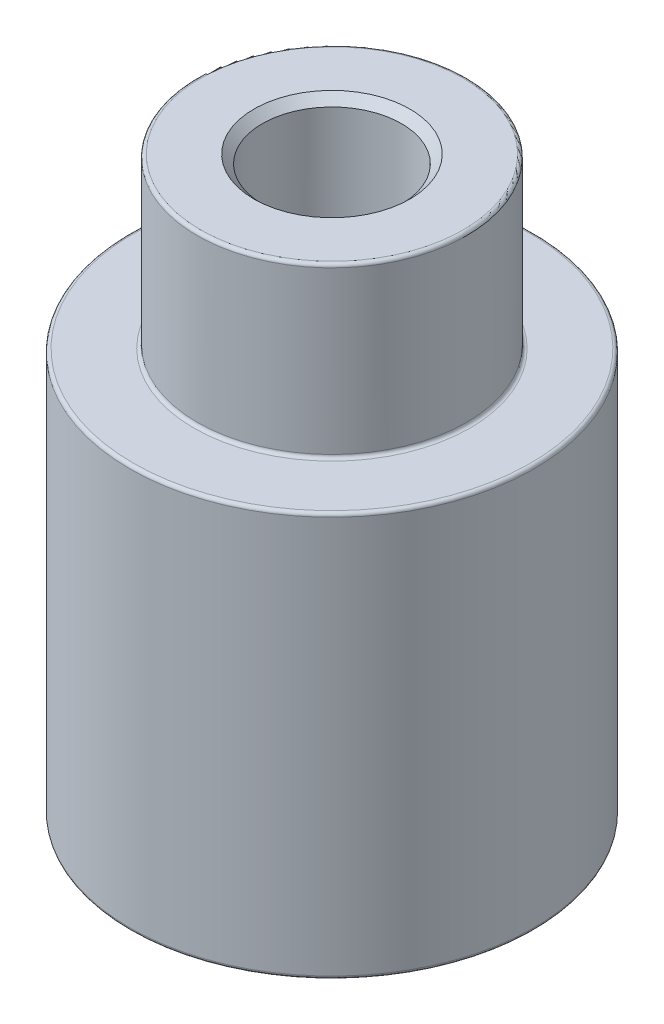
ISO-10303-21;
HEADER;
FILE_DESCRIPTION(('STEP AP214'),'2;1');
FILE_NAME('part.step','',(''),(''),'','','');
FILE_SCHEMA(('AUTOMOTIVE_DESIGN { 1 0 10303 214 1 1 1 1 }'));
ENDSEC;
DATA;
#1=APPLICATION_CONTEXT('core data for automotive mechanical design processes');
#2=APPLICATION_PROTOCOL_DEFINITION('international standard','automotive_design',2000,#1);
#3=PRODUCT_CONTEXT('',#1,'mechanical');
#4=PRODUCT('Part','Part','',(#3));
#5=PRODUCT_RELATED_PRODUCT_CATEGORY('part','',(#4));
#6=PRODUCT_DEFINITION_FORMATION('','',#4);
#7=PRODUCT_DEFINITION_CONTEXT('part definition',#1,'design');
#8=PRODUCT_DEFINITION('design','',#6,#7);
#9=PRODUCT_DEFINITION_SHAPE('','',#8);
#10=(LENGTH_UNIT() NAMED_UNIT(*) SI_UNIT(.MILLI.,.METRE.));
#11=(NAMED_UNIT(*) PLANE_ANGLE_UNIT() SI_UNIT($,.RADIAN.));
#12=(NAMED_UNIT(*) SI_UNIT($,.STERADIAN.) SOLID_ANGLE_UNIT());
#13=UNCERTAINTY_MEASURE_WITH_UNIT(LENGTH_MEASURE(1.E-05),#10,'distance_accuracy_value','');
#14=(GEOMETRIC_REPRESENTATION_CONTEXT(3) GLOBAL_UNCERTAINTY_ASSIGNED_CONTEXT((#13)) GLOBAL_UNIT_ASSIGNED_CONTEXT((#10,
#11,#12)) REPRESENTATION_CONTEXT('',''));
#15=CARTESIAN_POINT('',(0.,0.,0.));
#16=DIRECTION('',(0.,0.,1.));
#17=DIRECTION('',(1.,0.,0.));
#18=AXIS2_PLACEMENT_3D('',#15,#16,#17);
#19=CARTESIAN_POINT('',(0.,4.99999999999545,0.));
#20=DIRECTION('',(0.,1.,0.));
#21=DIRECTION('',(0.,0.,1.));
#22=AXIS2_PLACEMENT_3D('',#19,#20,#21);
#23=CONICAL_SURFACE('',#22,2.31700000006185,0.785398163397448);
#24=CARTESIAN_POINT('',(0.,4.75,0.));
#25=DIRECTION('',(0.,1.,0.));
#26=DIRECTION('',(0.,0.,1.));
#27=AXIS2_PLACEMENT_3D('',#24,#25,#26);
#28=CIRCLE('',#27,2.067);
#29=CARTESIAN_POINT('',(0.,4.75,2.067));
#30=VERTEX_POINT('',#29);
#31=EDGE_CURVE('E143',#30,#30,#28,.F.);
#32=ORIENTED_EDGE('',*,*,#31,.T.);
#33=EDGE_LOOP('',(#32));
#34=FACE_BOUND('',#33,.T.);
#35=CARTESIAN_POINT('',(0.,4.99999999999545,0.));
#36=DIRECTION('',(0.,1.,0.));
#37=DIRECTION('',(0.,0.,1.));
#38=AXIS2_PLACEMENT_3D('',#35,#36,#37);
#39=CIRCLE('',#38,2.31700000006185);
#40=CARTESIAN_POINT('',(0.,4.99999999999545,2.31700000006185));
#41=VERTEX_POINT('',#40);
#42=EDGE_CURVE('E28',#41,#41,#39,.T.);
#43=ORIENTED_EDGE('',*,*,#42,.T.);
#44=EDGE_LOOP('',(#43));
#45=FACE_BOUND('',#44,.T.);
#46=ADVANCED_FACE('F25',(#34,#45),#23,.F.);
#47=CARTESIAN_POINT('',(0.,5.,0.));
#48=DIRECTION('',(0.,-1.,0.));
#49=DIRECTION('',(0.,0.,-1.));
#50=AXIS2_PLACEMENT_3D('',#47,#48,#49);
#51=PLANE('',#50);
#52=CARTESIAN_POINT('',(0.,5.,0.));
#53=DIRECTION('',(0.,-1.,0.));
#54=DIRECTION('',(0.,0.,-1.));
#55=AXIS2_PLACEMENT_3D('',#52,#53,#54);
#56=CIRCLE('',#55,3.9);
#57=CARTESIAN_POINT('',(0.,5.,-3.9));
#58=VERTEX_POINT('',#57);
#59=EDGE_CURVE('E138',#58,#58,#56,.T.);
#60=ORIENTED_EDGE('',*,*,#59,.F.);
#61=EDGE_LOOP('',(#60));
#62=FACE_BOUND('',#61,.T.);
#63=ORIENTED_EDGE('',*,*,#42,.F.);
#64=EDGE_LOOP('',(#63));
#65=FACE_BOUND('',#64,.T.);
#66=ADVANCED_FACE('F187',(#62,#65),#51,.F.);
#67=CARTESIAN_POINT('',(0.,-19.0208242989286,0.));
#68=DIRECTION('',(0.,1.,0.));
#69=DIRECTION('',(0.,0.,1.));
#70=AXIS2_PLACEMENT_3D('',#67,#68,#69);
#71=CYLINDRICAL_SURFACE('',#70,2.067);
#72=ORIENTED_EDGE('',*,*,#31,.F.);
#73=EDGE_LOOP('',(#72));
#74=FACE_BOUND('',#73,.T.);
#75=CARTESIAN_POINT('',(0.,-1.75000000001546,0.));
#76=DIRECTION('',(0.,-1.,0.));
#77=DIRECTION('',(0.,0.,1.));
#78=AXIS2_PLACEMENT_3D('',#75,#76,#77);
#79=CIRCLE('',#78,2.06700000001092);
#80=CARTESIAN_POINT('',(0.,-1.75000000001546,2.06700000001092));
#81=VERTEX_POINT('',#80);
#82=EDGE_CURVE('E133',#81,#81,#79,.T.);
#83=ORIENTED_EDGE('',*,*,#82,.T.);
#84=EDGE_LOOP('',(#83));
#85=FACE_BOUND('',#84,.T.);
#86=ADVANCED_FACE('F152',(#74,#85),#71,.F.);
#87=CARTESIAN_POINT('',(0.,4.9,0.));
#88=DIRECTION('',(0.,-1.,0.));
#89=DIRECTION('',(0.,0.,-1.));
#90=AXIS2_PLACEMENT_3D('',#87,#88,#89);
#91=TOROIDAL_SURFACE('',#90,3.9,0.1);
#92=CARTESIAN_POINT('',(0.,4.9,0.));
#93=DIRECTION('',(0.,-1.,0.));
#94=DIRECTION('',(0.,0.,-1.));
#95=AXIS2_PLACEMENT_3D('',#92,#93,#94);
#96=CIRCLE('',#95,4.);
#97=CARTESIAN_POINT('',(0.,4.9,-4.));
#98=VERTEX_POINT('',#97);
#99=EDGE_CURVE('E124',#98,#98,#96,.T.);
#100=ORIENTED_EDGE('',*,*,#99,.F.);
#101=EDGE_LOOP('',(#100));
#102=FACE_BOUND('',#101,.T.);
#103=ORIENTED_EDGE('',*,*,#59,.T.);
#104=EDGE_LOOP('',(#103));
#105=FACE_BOUND('',#104,.T.);
#106=ADVANCED_FACE('F146',(#102,#105),#91,.T.);
#107=CARTESIAN_POINT('',(0.,-1.99999999995271,0.));
#108=DIRECTION('',(0.,-1.,0.));
#109=DIRECTION('',(0.,0.,-1.));
#110=AXIS2_PLACEMENT_3D('',#107,#108,#109);
#111=CONICAL_SURFACE('',#110,2.31699999994817,0.785398163397448);
#112=ORIENTED_EDGE('',*,*,#82,.F.);
#113=EDGE_LOOP('',(#112));
#114=FACE_BOUND('',#113,.T.);
#115=CARTESIAN_POINT('',(0.,-1.99999999995271,0.));
#116=DIRECTION('',(0.,-1.,0.));
#117=DIRECTION('',(0.,0.,-1.));
#118=AXIS2_PLACEMENT_3D('',#115,#116,#117);
#119=CIRCLE('',#118,2.31699999994817);
#120=CARTESIAN_POINT('',(0.,-1.99999999995271,-2.31699999994817));
#121=VERTEX_POINT('',#120);
#122=EDGE_CURVE('E132',#121,#121,#119,.T.);
#123=ORIENTED_EDGE('',*,*,#122,.T.);
#124=EDGE_LOOP('',(#123));
#125=FACE_BOUND('',#124,.T.);
#126=ADVANCED_FACE('F151',(#114,#125),#111,.F.);
#127=CARTESIAN_POINT('',(0.,5.,0.));
#128=DIRECTION('',(0.,-1.,0.));
#129=DIRECTION('',(0.,0.,-1.));
#130=AXIS2_PLACEMENT_3D('',#127,#128,#129);
#131=CYLINDRICAL_SURFACE('',#130,4.);
#132=CARTESIAN_POINT('',(0.,0.1,0.));
#133=DIRECTION('',(0.,1.,0.));
#134=DIRECTION('',(0.,0.,1.));
#135=AXIS2_PLACEMENT_3D('',#132,#133,#134);
#136=CIRCLE('',#135,4.);
#137=CARTESIAN_POINT('',(0.,0.1,4.));
#138=VERTEX_POINT('',#137);
#139=EDGE_CURVE('E88',#138,#138,#136,.T.);
#140=ORIENTED_EDGE('',*,*,#139,.T.);
#141=EDGE_LOOP('',(#140));
#142=FACE_BOUND('',#141,.T.);
#143=ORIENTED_EDGE('',*,*,#99,.T.);
#144=EDGE_LOOP('',(#143));
#145=FACE_BOUND('',#144,.T.);
#146=ADVANCED_FACE('F171',(#142,#145),#131,.T.);
#147=CARTESIAN_POINT('',(0.,-2.,0.));
#148=DIRECTION('',(0.,1.,0.));
#149=DIRECTION('',(0.,0.,1.));
#150=AXIS2_PLACEMENT_3D('',#147,#148,#149);
#151=PLANE('',#150);
#152=DIRECTION('',(-0.499999908452591,0.,0.866025456639353));
#153=VECTOR('',#152,1.);
#154=CARTESIAN_POINT('',(-4.67653718043597,-2.,0.));
#155=LINE('',#154,#153);
#156=CARTESIAN_POINT('',(-4.67653718043597,-2.,0.));
#157=VERTEX_POINT('',#156);
#158=CARTESIAN_POINT('',(-2.33826901834283,-2.,-4.05000024717801));
#159=VERTEX_POINT('',#158);
#160=EDGE_CURVE('E84',#157,#159,#155,.F.);
#161=ORIENTED_EDGE('',*,*,#160,.T.);
#162=DIRECTION('',(-0.999999999999994,0.,-1.05709839671575E-07));
#163=VECTOR('',#162,1.);
#164=CARTESIAN_POINT('',(-2.33826887563457,-2.,-4.05000049435603));
#165=LINE('',#164,#163);
#166=CARTESIAN_POINT('',(2.33826859021799,-2.,-4.05));
#167=VERTEX_POINT('',#166);
#168=EDGE_CURVE('E79',#159,#167,#165,.F.);
#169=ORIENTED_EDGE('',*,*,#168,.T.);
#170=DIRECTION('',(-0.500000091547404,0.,-0.866025350929514));
#171=VECTOR('',#170,1.);
#172=CARTESIAN_POINT('',(2.33826859021799,-2.,-4.05));
#173=LINE('',#172,#171);
#174=CARTESIAN_POINT('',(4.67653775126914,-2.,0.));
#175=VERTEX_POINT('',#174);
#176=EDGE_CURVE('E76',#167,#175,#173,.F.);
#177=ORIENTED_EDGE('',*,*,#176,.T.);
#178=DIRECTION('',(0.500000091547404,0.,-0.866025350929514));
#179=VECTOR('',#178,1.);
#180=CARTESIAN_POINT('',(4.67653775126914,-2.,0.));
#181=LINE('',#180,#179);
#182=CARTESIAN_POINT('',(2.33826851886383,-2.,4.050000123589));
#183=VERTEX_POINT('',#182);
#184=EDGE_CURVE('E102',#175,#183,#181,.F.);
#185=ORIENTED_EDGE('',*,*,#184,.T.);
#186=DIRECTION('',(0.999999999999994,0.,-1.05709839300633E-07));
#187=VECTOR('',#186,1.);
#188=CARTESIAN_POINT('',(2.33826859021799,-2.,4.05));
#189=LINE('',#188,#187);
#190=CARTESIAN_POINT('',(-2.33826887563456,-2.,4.05000049435602));
#191=VERTEX_POINT('',#190);
#192=EDGE_CURVE('E287',#183,#191,#189,.F.);
#193=ORIENTED_EDGE('',*,*,#192,.T.);
#194=DIRECTION('',(0.499999908452591,0.,0.866025456639353));
#195=VECTOR('',#194,1.);
#196=CARTESIAN_POINT('',(-2.33826887563457,-2.,4.05000049435602));
#197=LINE('',#196,#195);
#198=EDGE_CURVE('E282',#191,#157,#197,.F.);
#199=ORIENTED_EDGE('',*,*,#198,.T.);
#200=EDGE_LOOP('',(#161,#169,#177,#185,#193,#199));
#201=FACE_BOUND('',#200,.T.);
#202=ORIENTED_EDGE('',*,*,#122,.F.);
#203=EDGE_LOOP('',(#202));
#204=FACE_BOUND('',#203,.T.);
#205=ADVANCED_FACE('F81',(#201,#204),#151,.F.);
#206=CARTESIAN_POINT('',(0.,0.1,0.));
#207=DIRECTION('',(0.,1.,0.));
#208=DIRECTION('',(0.,0.,1.));
#209=AXIS2_PLACEMENT_3D('',#206,#207,#208);
#210=TOROIDAL_SURFACE('',#209,4.1,0.1);
#211=CARTESIAN_POINT('',(0.,0.,0.));
#212=DIRECTION('',(0.,1.,0.));
#213=DIRECTION('',(0.,0.,1.));
#214=AXIS2_PLACEMENT_3D('',#211,#212,#213);
#215=CIRCLE('',#214,4.1);
#216=CARTESIAN_POINT('',(0.,0.,4.1));
#217=VERTEX_POINT('',#216);
#218=EDGE_CURVE('E278',#217,#217,#215,.F.);
#219=ORIENTED_EDGE('',*,*,#218,.F.);
#220=EDGE_LOOP('',(#219));
#221=FACE_BOUND('',#220,.T.);
#222=ORIENTED_EDGE('',*,*,#139,.F.);
#223=EDGE_LOOP('',(#222));
#224=FACE_BOUND('',#223,.T.);
#225=ADVANCED_FACE('F110',(#221,#224),#210,.F.);
#226=CARTESIAN_POINT('',(-2.33826887563457,-2.,-4.05000049435603));
#227=DIRECTION('',(1.05709839671575E-07,0.,-0.999999999999994));
#228=DIRECTION('',(-0.999999999999994,0.,-1.05709839671575E-07));
#229=AXIS2_PLACEMENT_3D('',#226,#227,#228);
#230=PLANE('',#229);
#231=DIRECTION('',(0.,1.,0.));
#232=VECTOR('',#231,1.);
#233=CARTESIAN_POINT('',(2.33826859021799,-2.,-4.05));
#234=LINE('',#233,#232);
#235=CARTESIAN_POINT('',(2.33826851886383,-12.,-4.05000012358901));
#236=VERTEX_POINT('',#235);
#237=EDGE_CURVE('E87',#236,#167,#234,.T.);
#238=ORIENTED_EDGE('',*,*,#237,.T.);
#239=ORIENTED_EDGE('',*,*,#168,.F.);
#240=DIRECTION('',(0.,1.,0.));
#241=VECTOR('',#240,1.);
#242=CARTESIAN_POINT('',(-2.33826887563457,-2.,-4.05000049435603));
#243=LINE('',#242,#241);
#244=CARTESIAN_POINT('',(-2.33826887563457,-12.,-4.05000049435603));
#245=VERTEX_POINT('',#244);
#246=EDGE_CURVE('E271',#159,#245,#243,.F.);
#247=ORIENTED_EDGE('',*,*,#246,.T.);
#248=DIRECTION('',(1.,0.,0.));
#249=VECTOR('',#248,1.);
#250=CARTESIAN_POINT('',(0.,-12.,-4.05000049435603));
#251=LINE('',#250,#249);
#252=EDGE_CURVE('E93',#245,#236,#251,.T.);
#253=ORIENTED_EDGE('',*,*,#252,.T.);
#254=EDGE_LOOP('',(#238,#239,#247,#253));
#255=FACE_BOUND('',#254,.T.);
#256=ADVANCED_FACE('F91',(#255),#230,.F.);
#257=CARTESIAN_POINT('',(2.33826859021799,-2.,-4.05));
#258=DIRECTION('',(0.866025350929514,0.,-0.500000091547404));
#259=DIRECTION('',(-0.500000091547404,0.,-0.866025350929514));
#260=AXIS2_PLACEMENT_3D('',#257,#258,#259);
#261=PLANE('',#260);
#262=DIRECTION('',(0.,1.,0.));
#263=VECTOR('',#262,1.);
#264=CARTESIAN_POINT('',(4.67653775126914,-2.,0.));
#265=LINE('',#264,#263);
#266=CARTESIAN_POINT('',(4.67653775126914,-12.,0.));
#267=VERTEX_POINT('',#266);
#268=EDGE_CURVE('E99',#267,#175,#265,.T.);
#269=ORIENTED_EDGE('',*,*,#268,.T.);
#270=ORIENTED_EDGE('',*,*,#176,.F.);
#271=ORIENTED_EDGE('',*,*,#237,.F.);
#272=DIRECTION('',(0.500000091547403,0.,0.866025350929514));
#273=VECTOR('',#272,1.);
#274=CARTESIAN_POINT('',(2.33826859021799,-12.,-4.05));
#275=LINE('',#274,#273);
#276=EDGE_CURVE('E307',#236,#267,#275,.T.);
#277=ORIENTED_EDGE('',*,*,#276,.T.);
#278=EDGE_LOOP('',(#269,#270,#271,#277));
#279=FACE_BOUND('',#278,.T.);
#280=ADVANCED_FACE('F97',(#279),#261,.F.);
#281=CARTESIAN_POINT('',(4.67653775126914,-2.,0.));
#282=DIRECTION('',(0.866025350929514,0.,0.500000091547404));
#283=DIRECTION('',(0.500000091547404,0.,-0.866025350929514));
#284=AXIS2_PLACEMENT_3D('',#281,#282,#283);
#285=PLANE('',#284);
#286=DIRECTION('',(0.,1.,0.));
#287=VECTOR('',#286,1.);
#288=CARTESIAN_POINT('',(2.33826859021799,-2.,4.05));
#289=LINE('',#288,#287);
#290=CARTESIAN_POINT('',(2.33826859021799,-12.,4.05));
#291=VERTEX_POINT('',#290);
#292=EDGE_CURVE('E289',#291,#183,#289,.T.);
#293=ORIENTED_EDGE('',*,*,#292,.T.);
#294=ORIENTED_EDGE('',*,*,#184,.F.);
#295=ORIENTED_EDGE('',*,*,#268,.F.);
#296=DIRECTION('',(-0.500000091547403,0.,0.866025350929514));
#297=VECTOR('',#296,1.);
#298=CARTESIAN_POINT('',(4.67653775126914,-12.,0.));
#299=LINE('',#298,#297);
#300=EDGE_CURVE('E296',#267,#291,#299,.T.);
#301=ORIENTED_EDGE('',*,*,#300,.T.);
#302=EDGE_LOOP('',(#293,#294,#295,#301));
#303=FACE_BOUND('',#302,.T.);
#304=ADVANCED_FACE('F294',(#303),#285,.F.);
#305=CARTESIAN_POINT('',(2.33826859021799,-2.,4.05));
#306=DIRECTION('',(1.05709839300633E-07,0.,0.999999999999994));
#307=DIRECTION('',(0.999999999999994,0.,-1.05709839300633E-07));
#308=AXIS2_PLACEMENT_3D('',#305,#306,#307);
#309=PLANE('',#308);
#310=DIRECTION('',(0.,1.,0.));
#311=VECTOR('',#310,1.);
#312=CARTESIAN_POINT('',(-2.33826887563457,-2.,4.05000049435602));
#313=LINE('',#312,#311);
#314=CARTESIAN_POINT('',(-2.33826894698869,-12.,4.05000037076702));
#315=VERTEX_POINT('',#314);
#316=EDGE_CURVE('E284',#315,#191,#313,.T.);
#317=ORIENTED_EDGE('',*,*,#316,.T.);
#318=ORIENTED_EDGE('',*,*,#192,.F.);
#319=ORIENTED_EDGE('',*,*,#292,.F.);
#320=DIRECTION('',(1.,0.,0.));
#321=VECTOR('',#320,1.);
#322=CARTESIAN_POINT('',(0.,-12.,4.05));
#323=LINE('',#322,#321);
#324=EDGE_CURVE('E301',#291,#315,#323,.F.);
#325=ORIENTED_EDGE('',*,*,#324,.T.);
#326=EDGE_LOOP('',(#317,#318,#319,#325));
#327=FACE_BOUND('',#326,.T.);
#328=ADVANCED_FACE('F299',(#327),#309,.F.);
#329=CARTESIAN_POINT('',(-2.33826887563457,-2.,4.05000049435602));
#330=DIRECTION('',(-0.866025456639353,0.,0.499999908452591));
#331=DIRECTION('',(0.499999908452591,0.,0.866025456639353));
#332=AXIS2_PLACEMENT_3D('',#329,#330,#331);
#333=PLANE('',#332);
#334=DIRECTION('',(0.,1.,0.));
#335=VECTOR('',#334,1.);
#336=CARTESIAN_POINT('',(-4.67653718043597,-2.,0.));
#337=LINE('',#336,#335);
#338=CARTESIAN_POINT('',(-4.67653718043597,-12.,0.));
#339=VERTEX_POINT('',#338);
#340=EDGE_CURVE('E280',#339,#157,#337,.T.);
#341=ORIENTED_EDGE('',*,*,#340,.T.);
#342=ORIENTED_EDGE('',*,*,#198,.F.);
#343=ORIENTED_EDGE('',*,*,#316,.F.);
#344=DIRECTION('',(-0.499999908452593,0.,-0.866025456639352));
#345=VECTOR('',#344,1.);
#346=CARTESIAN_POINT('',(-2.33826887563456,-12.,4.05000049435602));
#347=LINE('',#346,#345);
#348=EDGE_CURVE('E43',#315,#339,#347,.T.);
#349=ORIENTED_EDGE('',*,*,#348,.T.);
#350=EDGE_LOOP('',(#341,#342,#343,#349));
#351=FACE_BOUND('',#350,.T.);
#352=ADVANCED_FACE('F302',(#351),#333,.F.);
#353=CARTESIAN_POINT('',(-4.67653718043597,-2.,0.));
#354=DIRECTION('',(-0.866025456639353,0.,-0.499999908452591));
#355=DIRECTION('',(-0.499999908452591,0.,0.866025456639353));
#356=AXIS2_PLACEMENT_3D('',#353,#354,#355);
#357=PLANE('',#356);
#358=ORIENTED_EDGE('',*,*,#246,.F.);
#359=ORIENTED_EDGE('',*,*,#160,.F.);
#360=ORIENTED_EDGE('',*,*,#340,.F.);
#361=DIRECTION('',(0.49999990845259,0.,-0.866025456639354));
#362=VECTOR('',#361,1.);
#363=CARTESIAN_POINT('',(-4.67653718043597,-12.,0.));
#364=LINE('',#363,#362);
#365=EDGE_CURVE('E229',#339,#245,#364,.T.);
#366=ORIENTED_EDGE('',*,*,#365,.T.);
#367=EDGE_LOOP('',(#358,#359,#360,#366));
#368=FACE_BOUND('',#367,.T.);
#369=ADVANCED_FACE('F244',(#368),#357,.F.);
#370=CARTESIAN_POINT('',(0.,0.,0.));
#371=DIRECTION('',(0.,1.,0.));
#372=DIRECTION('',(0.,0.,1.));
#373=AXIS2_PLACEMENT_3D('',#370,#371,#372);
#374=PLANE('',#373);
#375=ORIENTED_EDGE('',*,*,#218,.T.);
#376=EDGE_LOOP('',(#375));
#377=FACE_BOUND('',#376,.T.);
#378=CARTESIAN_POINT('',(0.,0.,0.));
#379=DIRECTION('',(0.,-1.,0.));
#380=DIRECTION('',(0.,0.,1.));
#381=AXIS2_PLACEMENT_3D('',#378,#379,#380);
#382=CIRCLE('',#381,5.9);
#383=CARTESIAN_POINT('',(0.,0.,5.9));
#384=VERTEX_POINT('',#383);
#385=EDGE_CURVE('E267',#384,#384,#382,.T.);
#386=ORIENTED_EDGE('',*,*,#385,.F.);
#387=EDGE_LOOP('',(#386));
#388=FACE_BOUND('',#387,.T.);
#389=ADVANCED_FACE('F240',(#377,#388),#374,.T.);
#390=CARTESIAN_POINT('',(0.,-12.,0.));
#391=DIRECTION('',(0.,1.,0.));
#392=DIRECTION('',(0.,0.,1.));
#393=AXIS2_PLACEMENT_3D('',#390,#391,#392);
#394=PLANE('',#393);
#395=CARTESIAN_POINT('',(0.,-12.,0.));
#396=DIRECTION('',(0.,1.,0.));
#397=DIRECTION('',(0.,0.,1.));
#398=AXIS2_PLACEMENT_3D('',#395,#396,#397);
#399=CIRCLE('',#398,5.9);
#400=CARTESIAN_POINT('',(0.,-12.,5.9));
#401=VERTEX_POINT('',#400);
#402=EDGE_CURVE('E225',#401,#401,#399,.T.);
#403=ORIENTED_EDGE('',*,*,#402,.F.);
#404=EDGE_LOOP('',(#403));
#405=FACE_BOUND('',#404,.T.);
#406=ORIENTED_EDGE('',*,*,#348,.F.);
#407=ORIENTED_EDGE('',*,*,#324,.F.);
#408=ORIENTED_EDGE('',*,*,#300,.F.);
#409=ORIENTED_EDGE('',*,*,#276,.F.);
#410=ORIENTED_EDGE('',*,*,#252,.F.);
#411=ORIENTED_EDGE('',*,*,#365,.F.);
#412=EDGE_LOOP('',(#406,#407,#408,#409,#410,#411));
#413=FACE_BOUND('',#412,.T.);
#414=ADVANCED_FACE('F231',(#405,#413),#394,.F.);
#415=CARTESIAN_POINT('',(0.,-0.0999999999999994,0.));
#416=DIRECTION('',(0.,1.,0.));
#417=DIRECTION('',(0.,0.,1.));
#418=AXIS2_PLACEMENT_3D('',#415,#416,#417);
#419=TOROIDAL_SURFACE('',#418,5.9,0.1);
#420=ORIENTED_EDGE('',*,*,#385,.T.);
#421=EDGE_LOOP('',(#420));
#422=FACE_BOUND('',#421,.T.);
#423=CARTESIAN_POINT('',(0.,-0.0999999999999994,0.));
#424=DIRECTION('',(0.,1.,0.));
#425=DIRECTION('',(0.,0.,1.));
#426=AXIS2_PLACEMENT_3D('',#423,#424,#425);
#427=CIRCLE('',#426,6.);
#428=CARTESIAN_POINT('',(0.,-0.0999999999999994,6.));
#429=VERTEX_POINT('',#428);
#430=EDGE_CURVE('E34',#429,#429,#427,.F.);
#431=ORIENTED_EDGE('',*,*,#430,.F.);
#432=EDGE_LOOP('',(#431));
#433=FACE_BOUND('',#432,.T.);
#434=ADVANCED_FACE('F204',(#422,#433),#419,.T.);
#435=CARTESIAN_POINT('',(0.,-11.9,0.));
#436=DIRECTION('',(0.,1.,0.));
#437=DIRECTION('',(0.,0.,1.));
#438=AXIS2_PLACEMENT_3D('',#435,#436,#437);
#439=TOROIDAL_SURFACE('',#438,5.9,0.1);
#440=CARTESIAN_POINT('',(0.,-11.9,0.));
#441=DIRECTION('',(0.,1.,0.));
#442=DIRECTION('',(0.,0.,1.));
#443=AXIS2_PLACEMENT_3D('',#440,#441,#442);
#444=CIRCLE('',#443,6.);
#445=CARTESIAN_POINT('',(0.,-11.9,6.));
#446=VERTEX_POINT('',#445);
#447=EDGE_CURVE('E13',#446,#446,#444,.T.);
#448=ORIENTED_EDGE('',*,*,#447,.F.);
#449=EDGE_LOOP('',(#448));
#450=FACE_BOUND('',#449,.T.);
#451=ORIENTED_EDGE('',*,*,#402,.T.);
#452=EDGE_LOOP('',(#451));
#453=FACE_BOUND('',#452,.T.);
#454=ADVANCED_FACE('F198',(#450,#453),#439,.T.);
#455=CARTESIAN_POINT('',(0.,-12.,0.));
#456=DIRECTION('',(0.,1.,0.));
#457=DIRECTION('',(0.,0.,1.));
#458=AXIS2_PLACEMENT_3D('',#455,#456,#457);
#459=CYLINDRICAL_SURFACE('',#458,6.);
#460=ORIENTED_EDGE('',*,*,#447,.T.);
#461=EDGE_LOOP('',(#460));
#462=FACE_BOUND('',#461,.T.);
#463=ORIENTED_EDGE('',*,*,#430,.T.);
#464=EDGE_LOOP('',(#463));
#465=FACE_BOUND('',#464,.T.);
#466=ADVANCED_FACE('F196',(#462,#465),#459,.T.);
#467=CLOSED_SHELL('',(#46,#66,#86,#106,#126,#146,#205,#225,#256,#280,#304,#328,#352,#369,#389,
#414,#434,#454,#466));
#468=MANIFOLD_SOLID_BREP('B1',#467);
#469=ADVANCED_BREP_SHAPE_REPRESENTATION('',(#18,#468),#14);
#470=SHAPE_DEFINITION_REPRESENTATION(#9,#469);
ENDSEC;
END-ISO-10303-21;
